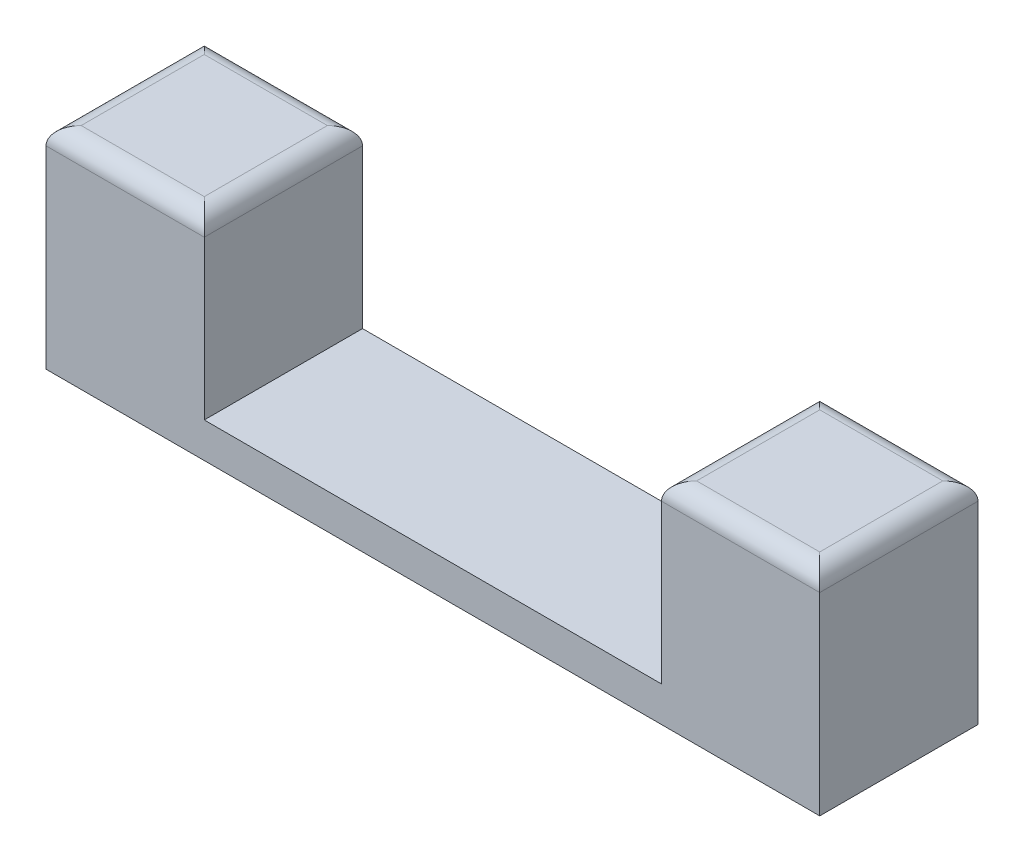
ISO-10303-21;
HEADER;
FILE_DESCRIPTION(('STEP AP214'),'2;1');
FILE_NAME('part.step','',(''),(''),'','','');
FILE_SCHEMA(('AUTOMOTIVE_DESIGN { 1 0 10303 214 1 1 1 1 }'));
ENDSEC;
DATA;
#1=APPLICATION_CONTEXT('core data for automotive mechanical design processes');
#2=APPLICATION_PROTOCOL_DEFINITION('international standard','automotive_design',2000,#1);
#3=PRODUCT_CONTEXT('',#1,'mechanical');
#4=PRODUCT('Part','Part','',(#3));
#5=PRODUCT_RELATED_PRODUCT_CATEGORY('part','',(#4));
#6=PRODUCT_DEFINITION_FORMATION('','',#4);
#7=PRODUCT_DEFINITION_CONTEXT('part definition',#1,'design');
#8=PRODUCT_DEFINITION('design','',#6,#7);
#9=PRODUCT_DEFINITION_SHAPE('','',#8);
#10=(LENGTH_UNIT() NAMED_UNIT(*) SI_UNIT(.MILLI.,.METRE.));
#11=(NAMED_UNIT(*) PLANE_ANGLE_UNIT() SI_UNIT($,.RADIAN.));
#12=(NAMED_UNIT(*) SI_UNIT($,.STERADIAN.) SOLID_ANGLE_UNIT());
#13=UNCERTAINTY_MEASURE_WITH_UNIT(LENGTH_MEASURE(1.E-05),#10,'distance_accuracy_value','');
#14=(GEOMETRIC_REPRESENTATION_CONTEXT(3) GLOBAL_UNCERTAINTY_ASSIGNED_CONTEXT((#13)) GLOBAL_UNIT_ASSIGNED_CONTEXT((#10,
#11,#12)) REPRESENTATION_CONTEXT('',''));
#15=CARTESIAN_POINT('',(0.,0.,0.));
#16=DIRECTION('',(0.,0.,1.));
#17=DIRECTION('',(1.,0.,0.));
#18=AXIS2_PLACEMENT_3D('',#15,#16,#17);
#19=CARTESIAN_POINT('',(0.,1.,0.));
#20=DIRECTION('',(0.,1.,0.));
#21=DIRECTION('',(0.,0.,1.));
#22=AXIS2_PLACEMENT_3D('',#19,#20,#21);
#23=PLANE('',#22);
#24=DIRECTION('',(1.,0.,0.));
#25=VECTOR('',#24,1.);
#26=CARTESIAN_POINT('',(-11.,1.,2.25));
#27=LINE('',#26,#25);
#28=CARTESIAN_POINT('',(-6.5,1.,2.25));
#29=VERTEX_POINT('',#28);
#30=CARTESIAN_POINT('',(6.5,1.,2.25));
#31=VERTEX_POINT('',#30);
#32=EDGE_CURVE('E145',#29,#31,#27,.T.);
#33=ORIENTED_EDGE('',*,*,#32,.T.);
#34=DIRECTION('',(0.,0.,1.));
#35=VECTOR('',#34,1.);
#36=CARTESIAN_POINT('',(6.5,1.,-2.25));
#37=LINE('',#36,#35);
#38=CARTESIAN_POINT('',(6.5,1.,-2.25));
#39=VERTEX_POINT('',#38);
#40=EDGE_CURVE('E144',#39,#31,#37,.T.);
#41=ORIENTED_EDGE('',*,*,#40,.F.);
#42=DIRECTION('',(-1.,0.,0.));
#43=VECTOR('',#42,1.);
#44=CARTESIAN_POINT('',(-11.,1.,-2.25));
#45=LINE('',#44,#43);
#46=CARTESIAN_POINT('',(-6.5,1.,-2.25));
#47=VERTEX_POINT('',#46);
#48=EDGE_CURVE('E127',#39,#47,#45,.T.);
#49=ORIENTED_EDGE('',*,*,#48,.T.);
#50=DIRECTION('',(0.,0.,-1.));
#51=VECTOR('',#50,1.);
#52=CARTESIAN_POINT('',(-6.5,1.,-2.25));
#53=LINE('',#52,#51);
#54=EDGE_CURVE('E136',#29,#47,#53,.T.);
#55=ORIENTED_EDGE('',*,*,#54,.F.);
#56=EDGE_LOOP('',(#33,#41,#49,#55));
#57=FACE_BOUND('',#56,.T.);
#58=ADVANCED_FACE('F33',(#57),#23,.T.);
#59=CARTESIAN_POINT('',(11.,1.,-2.25));
#60=DIRECTION('',(-1.,0.,0.));
#61=DIRECTION('',(0.,0.,1.));
#62=AXIS2_PLACEMENT_3D('',#59,#60,#61);
#63=PLANE('',#62);
#64=DIRECTION('',(0.,-1.,0.));
#65=VECTOR('',#64,1.);
#66=CARTESIAN_POINT('',(11.,1.,-2.25));
#67=LINE('',#66,#65);
#68=CARTESIAN_POINT('',(11.,5.5,-2.25));
#69=VERTEX_POINT('',#68);
#70=CARTESIAN_POINT('',(11.,0.,-2.25));
#71=VERTEX_POINT('',#70);
#72=EDGE_CURVE('E172',#69,#71,#67,.T.);
#73=ORIENTED_EDGE('',*,*,#72,.F.);
#74=DIRECTION('',(0.,0.,-1.));
#75=VECTOR('',#74,1.);
#76=CARTESIAN_POINT('',(11.,5.5,-2.25));
#77=LINE('',#76,#75);
#78=CARTESIAN_POINT('',(11.,5.5,2.25));
#79=VERTEX_POINT('',#78);
#80=EDGE_CURVE('E183',#69,#79,#77,.F.);
#81=ORIENTED_EDGE('',*,*,#80,.T.);
#82=DIRECTION('',(0.,-1.,0.));
#83=VECTOR('',#82,1.);
#84=CARTESIAN_POINT('',(11.,1.,2.25));
#85=LINE('',#84,#83);
#86=CARTESIAN_POINT('',(11.,0.,2.25));
#87=VERTEX_POINT('',#86);
#88=EDGE_CURVE('E235',#79,#87,#85,.T.);
#89=ORIENTED_EDGE('',*,*,#88,.T.);
#90=DIRECTION('',(0.,0.,-1.));
#91=VECTOR('',#90,1.);
#92=CARTESIAN_POINT('',(11.,0.,-2.25));
#93=LINE('',#92,#91);
#94=EDGE_CURVE('E187',#87,#71,#93,.T.);
#95=ORIENTED_EDGE('',*,*,#94,.T.);
#96=EDGE_LOOP('',(#73,#81,#89,#95));
#97=FACE_BOUND('',#96,.T.);
#98=ADVANCED_FACE('F247',(#97),#63,.F.);
#99=CARTESIAN_POINT('',(-11.,1.,-2.25));
#100=DIRECTION('',(0.,0.,1.));
#101=DIRECTION('',(1.,0.,0.));
#102=AXIS2_PLACEMENT_3D('',#99,#100,#101);
#103=PLANE('',#102);
#104=DIRECTION('',(0.,-1.,0.));
#105=VECTOR('',#104,1.);
#106=CARTESIAN_POINT('',(6.5,6.,-2.25));
#107=LINE('',#106,#105);
#108=CARTESIAN_POINT('',(6.5,5.5,-2.25));
#109=VERTEX_POINT('',#108);
#110=EDGE_CURVE('E150',#109,#39,#107,.T.);
#111=ORIENTED_EDGE('',*,*,#110,.F.);
#112=DIRECTION('',(-1.,0.,0.));
#113=VECTOR('',#112,1.);
#114=CARTESIAN_POINT('',(-11.,5.5,-2.25));
#115=LINE('',#114,#113);
#116=EDGE_CURVE('E180',#109,#69,#115,.F.);
#117=ORIENTED_EDGE('',*,*,#116,.T.);
#118=ORIENTED_EDGE('',*,*,#72,.T.);
#119=DIRECTION('',(-1.,0.,0.));
#120=VECTOR('',#119,1.);
#121=CARTESIAN_POINT('',(-11.,0.,-2.25));
#122=LINE('',#121,#120);
#123=CARTESIAN_POINT('',(-11.,0.,-2.25));
#124=VERTEX_POINT('',#123);
#125=EDGE_CURVE('E232',#71,#124,#122,.T.);
#126=ORIENTED_EDGE('',*,*,#125,.T.);
#127=DIRECTION('',(0.,-1.,0.));
#128=VECTOR('',#127,1.);
#129=CARTESIAN_POINT('',(-11.,1.,-2.25));
#130=LINE('',#129,#128);
#131=CARTESIAN_POINT('',(-11.,5.5,-2.25));
#132=VERTEX_POINT('',#131);
#133=EDGE_CURVE('E228',#132,#124,#130,.T.);
#134=ORIENTED_EDGE('',*,*,#133,.F.);
#135=DIRECTION('',(-1.,0.,0.));
#136=VECTOR('',#135,1.);
#137=CARTESIAN_POINT('',(-6.5,5.5,-2.25));
#138=LINE('',#137,#136);
#139=CARTESIAN_POINT('',(-6.5,5.5,-2.25));
#140=VERTEX_POINT('',#139);
#141=EDGE_CURVE('E130',#132,#140,#138,.F.);
#142=ORIENTED_EDGE('',*,*,#141,.T.);
#143=DIRECTION('',(0.,-1.,0.));
#144=VECTOR('',#143,1.);
#145=CARTESIAN_POINT('',(-6.5,6.,-2.25));
#146=LINE('',#145,#144);
#147=EDGE_CURVE('E123',#140,#47,#146,.T.);
#148=ORIENTED_EDGE('',*,*,#147,.T.);
#149=ORIENTED_EDGE('',*,*,#48,.F.);
#150=EDGE_LOOP('',(#111,#117,#118,#126,#134,#142,#148,#149));
#151=FACE_BOUND('',#150,.T.);
#152=ADVANCED_FACE('F126',(#151),#103,.F.);
#153=CARTESIAN_POINT('',(-11.,1.,-2.25));
#154=DIRECTION('',(1.,0.,0.));
#155=DIRECTION('',(0.,0.,-1.));
#156=AXIS2_PLACEMENT_3D('',#153,#154,#155);
#157=PLANE('',#156);
#158=DIRECTION('',(0.,-1.,0.));
#159=VECTOR('',#158,1.);
#160=CARTESIAN_POINT('',(-11.,1.,2.25));
#161=LINE('',#160,#159);
#162=CARTESIAN_POINT('',(-11.,5.5,2.25));
#163=VERTEX_POINT('',#162);
#164=CARTESIAN_POINT('',(-11.,0.,2.25));
#165=VERTEX_POINT('',#164);
#166=EDGE_CURVE('E230',#163,#165,#161,.T.);
#167=ORIENTED_EDGE('',*,*,#166,.F.);
#168=DIRECTION('',(0.,0.,1.));
#169=VECTOR('',#168,1.);
#170=CARTESIAN_POINT('',(-11.,5.5,-2.25));
#171=LINE('',#170,#169);
#172=EDGE_CURVE('E11',#163,#132,#171,.F.);
#173=ORIENTED_EDGE('',*,*,#172,.T.);
#174=ORIENTED_EDGE('',*,*,#133,.T.);
#175=DIRECTION('',(0.,0.,1.));
#176=VECTOR('',#175,1.);
#177=CARTESIAN_POINT('',(-11.,0.,-2.25));
#178=LINE('',#177,#176);
#179=EDGE_CURVE('E241',#124,#165,#178,.T.);
#180=ORIENTED_EDGE('',*,*,#179,.T.);
#181=EDGE_LOOP('',(#167,#173,#174,#180));
#182=FACE_BOUND('',#181,.T.);
#183=ADVANCED_FACE('F226',(#182),#157,.F.);
#184=CARTESIAN_POINT('',(-11.,1.,2.25));
#185=DIRECTION('',(0.,0.,-1.));
#186=DIRECTION('',(-1.,0.,0.));
#187=AXIS2_PLACEMENT_3D('',#184,#185,#186);
#188=PLANE('',#187);
#189=ORIENTED_EDGE('',*,*,#88,.F.);
#190=DIRECTION('',(1.,0.,0.));
#191=VECTOR('',#190,1.);
#192=CARTESIAN_POINT('',(-11.,5.5,2.25));
#193=LINE('',#192,#191);
#194=CARTESIAN_POINT('',(6.5,5.5,2.25));
#195=VERTEX_POINT('',#194);
#196=EDGE_CURVE('E189',#79,#195,#193,.F.);
#197=ORIENTED_EDGE('',*,*,#196,.T.);
#198=DIRECTION('',(0.,-1.,0.));
#199=VECTOR('',#198,1.);
#200=CARTESIAN_POINT('',(6.5,6.,2.25));
#201=LINE('',#200,#199);
#202=EDGE_CURVE('E152',#195,#31,#201,.T.);
#203=ORIENTED_EDGE('',*,*,#202,.T.);
#204=ORIENTED_EDGE('',*,*,#32,.F.);
#205=DIRECTION('',(0.,-1.,0.));
#206=VECTOR('',#205,1.);
#207=CARTESIAN_POINT('',(-6.5,6.,2.25));
#208=LINE('',#207,#206);
#209=CARTESIAN_POINT('',(-6.5,5.5,2.25));
#210=VERTEX_POINT('',#209);
#211=EDGE_CURVE('E135',#210,#29,#208,.T.);
#212=ORIENTED_EDGE('',*,*,#211,.F.);
#213=DIRECTION('',(1.,0.,0.));
#214=VECTOR('',#213,1.);
#215=CARTESIAN_POINT('',(-11.,5.5,2.25));
#216=LINE('',#215,#214);
#217=EDGE_CURVE('E185',#210,#163,#216,.F.);
#218=ORIENTED_EDGE('',*,*,#217,.T.);
#219=ORIENTED_EDGE('',*,*,#166,.T.);
#220=DIRECTION('',(1.,0.,0.));
#221=VECTOR('',#220,1.);
#222=CARTESIAN_POINT('',(-11.,0.,2.25));
#223=LINE('',#222,#221);
#224=EDGE_CURVE('E146',#165,#87,#223,.T.);
#225=ORIENTED_EDGE('',*,*,#224,.T.);
#226=EDGE_LOOP('',(#189,#197,#203,#204,#212,#218,#219,#225));
#227=FACE_BOUND('',#226,.T.);
#228=ADVANCED_FACE('F253',(#227),#188,.F.);
#229=CARTESIAN_POINT('',(0.,0.,0.));
#230=DIRECTION('',(0.,1.,0.));
#231=DIRECTION('',(0.,0.,1.));
#232=AXIS2_PLACEMENT_3D('',#229,#230,#231);
#233=PLANE('',#232);
#234=ORIENTED_EDGE('',*,*,#94,.F.);
#235=ORIENTED_EDGE('',*,*,#224,.F.);
#236=ORIENTED_EDGE('',*,*,#179,.F.);
#237=ORIENTED_EDGE('',*,*,#125,.F.);
#238=EDGE_LOOP('',(#234,#235,#236,#237));
#239=FACE_BOUND('',#238,.T.);
#240=ADVANCED_FACE('F251',(#239),#233,.F.);
#241=CARTESIAN_POINT('',(-6.5,6.,-2.25));
#242=DIRECTION('',(-1.,0.,0.));
#243=DIRECTION('',(0.,0.,1.));
#244=AXIS2_PLACEMENT_3D('',#241,#242,#243);
#245=PLANE('',#244);
#246=ORIENTED_EDGE('',*,*,#147,.F.);
#247=DIRECTION('',(0.,0.,-1.));
#248=VECTOR('',#247,1.);
#249=CARTESIAN_POINT('',(-6.5,5.5,2.25));
#250=LINE('',#249,#248);
#251=EDGE_CURVE('E42',#140,#210,#250,.F.);
#252=ORIENTED_EDGE('',*,*,#251,.T.);
#253=ORIENTED_EDGE('',*,*,#211,.T.);
#254=ORIENTED_EDGE('',*,*,#54,.T.);
#255=EDGE_LOOP('',(#246,#252,#253,#254));
#256=FACE_BOUND('',#255,.T.);
#257=ADVANCED_FACE('F148',(#256),#245,.F.);
#258=CARTESIAN_POINT('',(0.,6.,0.));
#259=DIRECTION('',(0.,1.,0.));
#260=DIRECTION('',(0.,0.,1.));
#261=AXIS2_PLACEMENT_3D('',#258,#259,#260);
#262=PLANE('',#261);
#263=DIRECTION('',(1.,0.,0.));
#264=VECTOR('',#263,1.);
#265=CARTESIAN_POINT('',(-6.5,6.,1.75));
#266=LINE('',#265,#264);
#267=CARTESIAN_POINT('',(-10.5,6.,1.75));
#268=VERTEX_POINT('',#267);
#269=CARTESIAN_POINT('',(-7.,6.,1.75));
#270=VERTEX_POINT('',#269);
#271=EDGE_CURVE('E50',#268,#270,#266,.T.);
#272=ORIENTED_EDGE('',*,*,#271,.T.);
#273=DIRECTION('',(0.,0.,-1.));
#274=VECTOR('',#273,1.);
#275=CARTESIAN_POINT('',(-7.,6.,-2.25));
#276=LINE('',#275,#274);
#277=CARTESIAN_POINT('',(-7.,6.,-1.75));
#278=VERTEX_POINT('',#277);
#279=EDGE_CURVE('E197',#270,#278,#276,.T.);
#280=ORIENTED_EDGE('',*,*,#279,.T.);
#281=DIRECTION('',(-1.,0.,0.));
#282=VECTOR('',#281,1.);
#283=CARTESIAN_POINT('',(-11.,6.,-1.75));
#284=LINE('',#283,#282);
#285=CARTESIAN_POINT('',(-10.5,6.,-1.75));
#286=VERTEX_POINT('',#285);
#287=EDGE_CURVE('E193',#278,#286,#284,.T.);
#288=ORIENTED_EDGE('',*,*,#287,.T.);
#289=DIRECTION('',(0.,0.,1.));
#290=VECTOR('',#289,1.);
#291=CARTESIAN_POINT('',(-10.5,6.,2.25));
#292=LINE('',#291,#290);
#293=EDGE_CURVE('E55',#286,#268,#292,.T.);
#294=ORIENTED_EDGE('',*,*,#293,.T.);
#295=EDGE_LOOP('',(#272,#280,#288,#294));
#296=FACE_BOUND('',#295,.T.);
#297=ADVANCED_FACE('F374',(#296),#262,.T.);
#298=CARTESIAN_POINT('',(6.5,6.,-2.25));
#299=DIRECTION('',(1.,0.,0.));
#300=DIRECTION('',(0.,0.,-1.));
#301=AXIS2_PLACEMENT_3D('',#298,#299,#300);
#302=PLANE('',#301);
#303=ORIENTED_EDGE('',*,*,#202,.F.);
#304=DIRECTION('',(0.,0.,1.));
#305=VECTOR('',#304,1.);
#306=CARTESIAN_POINT('',(6.5,5.5,-2.25));
#307=LINE('',#306,#305);
#308=EDGE_CURVE('E191',#195,#109,#307,.F.);
#309=ORIENTED_EDGE('',*,*,#308,.T.);
#310=ORIENTED_EDGE('',*,*,#110,.T.);
#311=ORIENTED_EDGE('',*,*,#40,.T.);
#312=EDGE_LOOP('',(#303,#309,#310,#311));
#313=FACE_BOUND('',#312,.T.);
#314=ADVANCED_FACE('F257',(#313),#302,.F.);
#315=CARTESIAN_POINT('',(0.,6.,0.));
#316=DIRECTION('',(0.,-1.,0.));
#317=DIRECTION('',(0.,0.,-1.));
#318=AXIS2_PLACEMENT_3D('',#315,#316,#317);
#319=PLANE('',#318);
#320=DIRECTION('',(0.,0.,-1.));
#321=VECTOR('',#320,1.);
#322=CARTESIAN_POINT('',(10.5,6.,0.));
#323=LINE('',#322,#321);
#324=CARTESIAN_POINT('',(10.5,6.,1.75));
#325=VERTEX_POINT('',#324);
#326=CARTESIAN_POINT('',(10.5,6.,-1.75));
#327=VERTEX_POINT('',#326);
#328=EDGE_CURVE('E174',#325,#327,#323,.T.);
#329=ORIENTED_EDGE('',*,*,#328,.T.);
#330=DIRECTION('',(-1.,0.,0.));
#331=VECTOR('',#330,1.);
#332=CARTESIAN_POINT('',(0.,6.,-1.75));
#333=LINE('',#332,#331);
#334=CARTESIAN_POINT('',(7.,6.,-1.75));
#335=VERTEX_POINT('',#334);
#336=EDGE_CURVE('E176',#327,#335,#333,.T.);
#337=ORIENTED_EDGE('',*,*,#336,.T.);
#338=DIRECTION('',(0.,0.,1.));
#339=VECTOR('',#338,1.);
#340=CARTESIAN_POINT('',(7.,6.,0.));
#341=LINE('',#340,#339);
#342=CARTESIAN_POINT('',(7.,6.,1.75));
#343=VERTEX_POINT('',#342);
#344=EDGE_CURVE('E169',#335,#343,#341,.T.);
#345=ORIENTED_EDGE('',*,*,#344,.T.);
#346=DIRECTION('',(1.,0.,0.));
#347=VECTOR('',#346,1.);
#348=CARTESIAN_POINT('',(0.,6.,1.75));
#349=LINE('',#348,#347);
#350=EDGE_CURVE('E171',#343,#325,#349,.T.);
#351=ORIENTED_EDGE('',*,*,#350,.T.);
#352=EDGE_LOOP('',(#329,#337,#345,#351));
#353=FACE_BOUND('',#352,.T.);
#354=ADVANCED_FACE('F273',(#353),#319,.F.);
#355=CARTESIAN_POINT('',(0.,5.5,1.75));
#356=DIRECTION('',(1.,0.,0.));
#357=DIRECTION('',(0.,0.,-1.));
#358=AXIS2_PLACEMENT_3D('',#355,#356,#357);
#359=CYLINDRICAL_SURFACE('',#358,0.5);
#360=CARTESIAN_POINT('',(7.,5.5,1.75));
#361=DIRECTION('',(0.707106781186548,0.,0.707106781186547));
#362=DIRECTION('',(-0.707106781186547,0.,0.707106781186548));
#363=AXIS2_PLACEMENT_3D('',#360,#361,#362);
#364=ELLIPSE('',#363,0.707106781186547,0.5);
#365=EDGE_CURVE('E204',#195,#343,#364,.F.);
#366=ORIENTED_EDGE('',*,*,#365,.F.);
#367=ORIENTED_EDGE('',*,*,#196,.F.);
#368=CARTESIAN_POINT('',(10.5,5.5,1.75));
#369=DIRECTION('',(0.707106781186547,0.,-0.707106781186547));
#370=DIRECTION('',(0.707106781186547,0.,0.707106781186547));
#371=AXIS2_PLACEMENT_3D('',#368,#369,#370);
#372=ELLIPSE('',#371,0.707106781186547,0.5);
#373=EDGE_CURVE('E207',#325,#79,#372,.T.);
#374=ORIENTED_EDGE('',*,*,#373,.F.);
#375=ORIENTED_EDGE('',*,*,#350,.F.);
#376=EDGE_LOOP('',(#366,#367,#374,#375));
#377=FACE_BOUND('',#376,.T.);
#378=ADVANCED_FACE('F279',(#377),#359,.T.);
#379=CARTESIAN_POINT('',(10.5,5.5,0.));
#380=DIRECTION('',(0.,0.,-1.));
#381=DIRECTION('',(-1.,0.,0.));
#382=AXIS2_PLACEMENT_3D('',#379,#380,#381);
#383=CYLINDRICAL_SURFACE('',#382,0.5);
#384=ORIENTED_EDGE('',*,*,#373,.T.);
#385=ORIENTED_EDGE('',*,*,#80,.F.);
#386=CARTESIAN_POINT('',(10.5,5.5,-1.75));
#387=DIRECTION('',(-0.707106781186547,0.,-0.707106781186547));
#388=DIRECTION('',(0.707106781186547,0.,-0.707106781186547));
#389=AXIS2_PLACEMENT_3D('',#386,#387,#388);
#390=ELLIPSE('',#389,0.707106781186547,0.5);
#391=EDGE_CURVE('E202',#327,#69,#390,.T.);
#392=ORIENTED_EDGE('',*,*,#391,.F.);
#393=ORIENTED_EDGE('',*,*,#328,.F.);
#394=EDGE_LOOP('',(#384,#385,#392,#393));
#395=FACE_BOUND('',#394,.T.);
#396=ADVANCED_FACE('F277',(#395),#383,.T.);
#397=CARTESIAN_POINT('',(7.,5.5,0.));
#398=DIRECTION('',(0.,0.,1.));
#399=DIRECTION('',(1.,0.,0.));
#400=AXIS2_PLACEMENT_3D('',#397,#398,#399);
#401=CYLINDRICAL_SURFACE('',#400,0.5);
#402=ORIENTED_EDGE('',*,*,#365,.T.);
#403=ORIENTED_EDGE('',*,*,#344,.F.);
#404=CARTESIAN_POINT('',(7.,5.5,-1.75));
#405=DIRECTION('',(-0.707106781186547,0.,0.707106781186548));
#406=DIRECTION('',(0.707106781186548,0.,0.707106781186547));
#407=AXIS2_PLACEMENT_3D('',#404,#405,#406);
#408=ELLIPSE('',#407,0.707106781186548,0.5);
#409=EDGE_CURVE('E200',#109,#335,#408,.F.);
#410=ORIENTED_EDGE('',*,*,#409,.F.);
#411=ORIENTED_EDGE('',*,*,#308,.F.);
#412=EDGE_LOOP('',(#402,#403,#410,#411));
#413=FACE_BOUND('',#412,.T.);
#414=ADVANCED_FACE('F270',(#413),#401,.T.);
#415=CARTESIAN_POINT('',(0.,5.5,-1.75));
#416=DIRECTION('',(-1.,0.,0.));
#417=DIRECTION('',(0.,0.,1.));
#418=AXIS2_PLACEMENT_3D('',#415,#416,#417);
#419=CYLINDRICAL_SURFACE('',#418,0.5);
#420=ORIENTED_EDGE('',*,*,#391,.T.);
#421=ORIENTED_EDGE('',*,*,#116,.F.);
#422=ORIENTED_EDGE('',*,*,#409,.T.);
#423=ORIENTED_EDGE('',*,*,#336,.F.);
#424=EDGE_LOOP('',(#420,#421,#422,#423));
#425=FACE_BOUND('',#424,.T.);
#426=ADVANCED_FACE('F264',(#425),#419,.T.);
#427=CARTESIAN_POINT('',(-10.5,5.5,0.));
#428=DIRECTION('',(0.,0.,-1.));
#429=DIRECTION('',(-1.,0.,0.));
#430=AXIS2_PLACEMENT_3D('',#427,#428,#429);
#431=CYLINDRICAL_SURFACE('',#430,0.5);
#432=CARTESIAN_POINT('',(-10.5,5.5,-1.75));
#433=DIRECTION('',(0.707106781186547,0.,-0.707106781186547));
#434=DIRECTION('',(0.707106781186547,0.,0.707106781186547));
#435=AXIS2_PLACEMENT_3D('',#432,#433,#434);
#436=ELLIPSE('',#435,0.707106781186547,0.5);
#437=EDGE_CURVE('E213',#132,#286,#436,.T.);
#438=ORIENTED_EDGE('',*,*,#437,.F.);
#439=ORIENTED_EDGE('',*,*,#172,.F.);
#440=CARTESIAN_POINT('',(-10.5,5.5,1.75));
#441=DIRECTION('',(-0.707106781186547,0.,-0.707106781186547));
#442=DIRECTION('',(0.707106781186547,0.,-0.707106781186547));
#443=AXIS2_PLACEMENT_3D('',#440,#441,#442);
#444=ELLIPSE('',#443,0.707106781186547,0.5);
#445=EDGE_CURVE('E37',#268,#163,#444,.F.);
#446=ORIENTED_EDGE('',*,*,#445,.F.);
#447=ORIENTED_EDGE('',*,*,#293,.F.);
#448=EDGE_LOOP('',(#438,#439,#446,#447));
#449=FACE_BOUND('',#448,.T.);
#450=ADVANCED_FACE('F35',(#449),#431,.T.);
#451=CARTESIAN_POINT('',(0.,5.5,1.75));
#452=DIRECTION('',(-1.,0.,0.));
#453=DIRECTION('',(0.,0.,1.));
#454=AXIS2_PLACEMENT_3D('',#451,#452,#453);
#455=CYLINDRICAL_SURFACE('',#454,0.5);
#456=ORIENTED_EDGE('',*,*,#445,.T.);
#457=ORIENTED_EDGE('',*,*,#217,.F.);
#458=CARTESIAN_POINT('',(-7.,5.5,1.75));
#459=DIRECTION('',(-0.707106781186547,0.,0.707106781186548));
#460=DIRECTION('',(-0.707106781186548,0.,-0.707106781186547));
#461=AXIS2_PLACEMENT_3D('',#458,#459,#460);
#462=ELLIPSE('',#461,0.707106781186548,0.5);
#463=EDGE_CURVE('E212',#270,#210,#462,.F.);
#464=ORIENTED_EDGE('',*,*,#463,.F.);
#465=ORIENTED_EDGE('',*,*,#271,.F.);
#466=EDGE_LOOP('',(#456,#457,#464,#465));
#467=FACE_BOUND('',#466,.T.);
#468=ADVANCED_FACE('F221',(#467),#455,.T.);
#469=CARTESIAN_POINT('',(0.,5.5,-1.75));
#470=DIRECTION('',(1.,0.,0.));
#471=DIRECTION('',(0.,0.,-1.));
#472=AXIS2_PLACEMENT_3D('',#469,#470,#471);
#473=CYLINDRICAL_SURFACE('',#472,0.5);
#474=ORIENTED_EDGE('',*,*,#437,.T.);
#475=ORIENTED_EDGE('',*,*,#287,.F.);
#476=CARTESIAN_POINT('',(-7.,5.5,-1.75));
#477=DIRECTION('',(0.707106781186548,0.,0.707106781186547));
#478=DIRECTION('',(0.707106781186547,0.,-0.707106781186548));
#479=AXIS2_PLACEMENT_3D('',#476,#477,#478);
#480=ELLIPSE('',#479,0.707106781186547,0.5);
#481=EDGE_CURVE('E210',#140,#278,#480,.T.);
#482=ORIENTED_EDGE('',*,*,#481,.F.);
#483=ORIENTED_EDGE('',*,*,#141,.F.);
#484=EDGE_LOOP('',(#474,#475,#482,#483));
#485=FACE_BOUND('',#484,.T.);
#486=ADVANCED_FACE('F328',(#485),#473,.T.);
#487=CARTESIAN_POINT('',(-7.,5.5,0.));
#488=DIRECTION('',(0.,0.,1.));
#489=DIRECTION('',(1.,0.,0.));
#490=AXIS2_PLACEMENT_3D('',#487,#488,#489);
#491=CYLINDRICAL_SURFACE('',#490,0.5);
#492=ORIENTED_EDGE('',*,*,#463,.T.);
#493=ORIENTED_EDGE('',*,*,#251,.F.);
#494=ORIENTED_EDGE('',*,*,#481,.T.);
#495=ORIENTED_EDGE('',*,*,#279,.F.);
#496=EDGE_LOOP('',(#492,#493,#494,#495));
#497=FACE_BOUND('',#496,.T.);
#498=ADVANCED_FACE('F334',(#497),#491,.T.);
#499=CLOSED_SHELL('',(#58,#98,#152,#183,#228,#240,#257,#297,#314,#354,#378,#396,#414,#426,#450,
#468,#486,#498));
#500=MANIFOLD_SOLID_BREP('B2',#499);
#501=ADVANCED_BREP_SHAPE_REPRESENTATION('',(#18,#500),#14);
#502=SHAPE_DEFINITION_REPRESENTATION(#9,#501);
ENDSEC;
END-ISO-10303-21;
